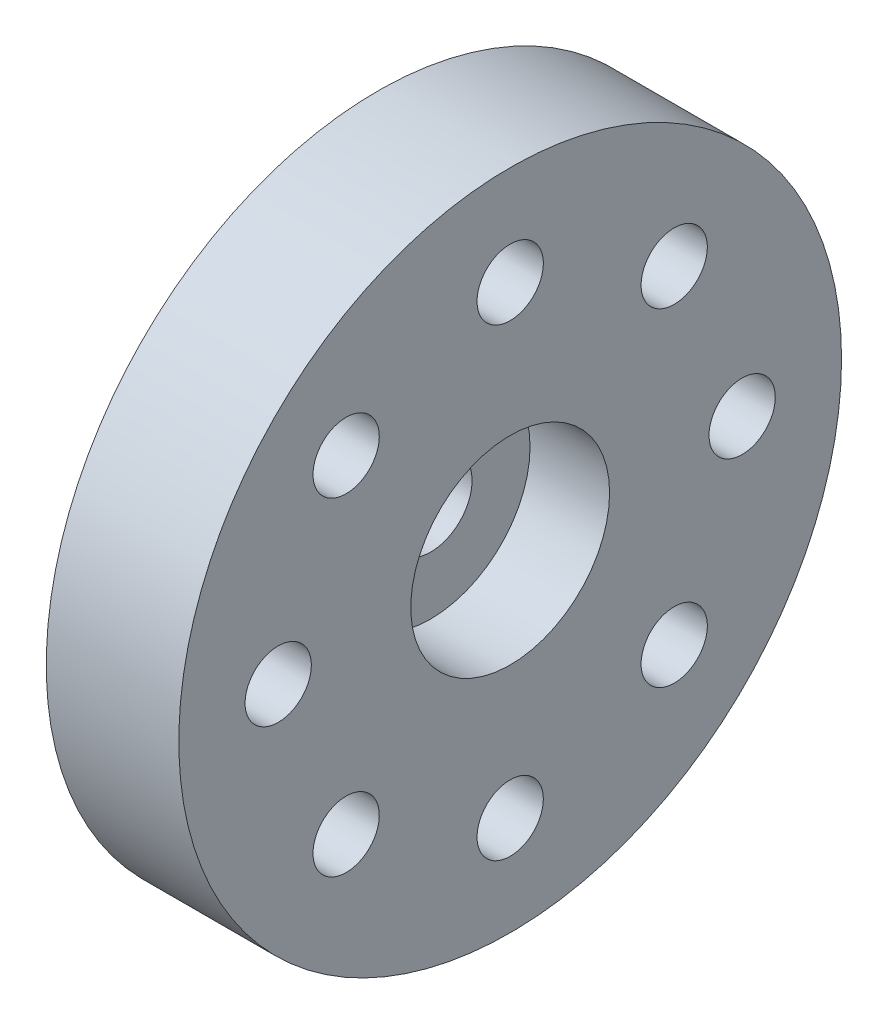
ISO-10303-21;
HEADER;
FILE_DESCRIPTION(('STEP AP214'),'2;1');
FILE_NAME('part.step','',(''),(''),'','','');
FILE_SCHEMA(('AUTOMOTIVE_DESIGN { 1 0 10303 214 1 1 1 1 }'));
ENDSEC;
DATA;
#1=APPLICATION_CONTEXT('core data for automotive mechanical design processes');
#2=APPLICATION_PROTOCOL_DEFINITION('international standard','automotive_design',2000,#1);
#3=PRODUCT_CONTEXT('',#1,'mechanical');
#4=PRODUCT('Part','Part','',(#3));
#5=PRODUCT_RELATED_PRODUCT_CATEGORY('part','',(#4));
#6=PRODUCT_DEFINITION_FORMATION('','',#4);
#7=PRODUCT_DEFINITION_CONTEXT('part definition',#1,'design');
#8=PRODUCT_DEFINITION('design','',#6,#7);
#9=PRODUCT_DEFINITION_SHAPE('','',#8);
#10=(LENGTH_UNIT() NAMED_UNIT(*) SI_UNIT(.MILLI.,.METRE.));
#11=(NAMED_UNIT(*) PLANE_ANGLE_UNIT() SI_UNIT($,.RADIAN.));
#12=(NAMED_UNIT(*) SI_UNIT($,.STERADIAN.) SOLID_ANGLE_UNIT());
#13=UNCERTAINTY_MEASURE_WITH_UNIT(LENGTH_MEASURE(1.E-05),#10,'distance_accuracy_value','');
#14=(GEOMETRIC_REPRESENTATION_CONTEXT(3) GLOBAL_UNCERTAINTY_ASSIGNED_CONTEXT((#13)) GLOBAL_UNIT_ASSIGNED_CONTEXT((#10,
#11,#12)) REPRESENTATION_CONTEXT('',''));
#15=CARTESIAN_POINT('',(0.,0.,0.));
#16=DIRECTION('',(0.,0.,1.));
#17=DIRECTION('',(1.,0.,0.));
#18=AXIS2_PLACEMENT_3D('',#15,#16,#17);
#19=CARTESIAN_POINT('',(0.,0.,0.));
#20=DIRECTION('',(1.,0.,0.));
#21=DIRECTION('',(0.,0.,-1.));
#22=AXIS2_PLACEMENT_3D('',#19,#20,#21);
#23=CYLINDRICAL_SURFACE('',#22,3.);
#24=CARTESIAN_POINT('',(4.,0.,0.));
#25=DIRECTION('',(1.,0.,0.));
#26=DIRECTION('',(0.,0.,-1.));
#27=AXIS2_PLACEMENT_3D('',#24,#25,#26);
#28=CIRCLE('',#27,3.);
#29=CARTESIAN_POINT('',(4.,0.,-3.));
#30=VERTEX_POINT('',#29);
#31=EDGE_CURVE('E62',#30,#30,#28,.T.);
#32=ORIENTED_EDGE('',*,*,#31,.T.);
#33=EDGE_LOOP('',(#32));
#34=FACE_BOUND('',#33,.T.);
#35=CARTESIAN_POINT('',(1.6,0.,0.));
#36=DIRECTION('',(-1.,0.,0.));
#37=DIRECTION('',(0.,0.,1.));
#38=AXIS2_PLACEMENT_3D('',#35,#36,#37);
#39=CIRCLE('',#38,3.);
#40=CARTESIAN_POINT('',(1.6,0.,3.));
#41=VERTEX_POINT('',#40);
#42=EDGE_CURVE('E10',#41,#41,#39,.F.);
#43=ORIENTED_EDGE('',*,*,#42,.F.);
#44=EDGE_LOOP('',(#43));
#45=FACE_BOUND('',#44,.T.);
#46=ADVANCED_FACE('F32',(#34,#45),#23,.F.);
#47=CARTESIAN_POINT('',(0.,0.,0.));
#48=DIRECTION('',(1.,0.,0.));
#49=DIRECTION('',(0.,0.,-1.));
#50=AXIS2_PLACEMENT_3D('',#47,#48,#49);
#51=PLANE('',#50);
#52=CARTESIAN_POINT('',(0.,0.,0.));
#53=DIRECTION('',(1.,0.,0.));
#54=DIRECTION('',(0.,0.,-1.));
#55=AXIS2_PLACEMENT_3D('',#52,#53,#54);
#56=CIRCLE('',#55,10.);
#57=CARTESIAN_POINT('',(0.,0.,-10.));
#58=VERTEX_POINT('',#57);
#59=EDGE_CURVE('E59',#58,#58,#56,.T.);
#60=ORIENTED_EDGE('',*,*,#59,.F.);
#61=EDGE_LOOP('',(#60));
#62=FACE_BOUND('',#61,.T.);
#63=CARTESIAN_POINT('',(0.,7.,0.));
#64=DIRECTION('',(-1.,0.,0.));
#65=DIRECTION('',(0.,0.,1.));
#66=AXIS2_PLACEMENT_3D('',#63,#64,#65);
#67=CIRCLE('',#66,1.);
#68=CARTESIAN_POINT('',(0.,7.,1.));
#69=VERTEX_POINT('',#68);
#70=EDGE_CURVE('E68',#69,#69,#67,.T.);
#71=ORIENTED_EDGE('',*,*,#70,.F.);
#72=EDGE_LOOP('',(#71));
#73=FACE_BOUND('',#72,.T.);
#74=CARTESIAN_POINT('',(0.,4.94974746830582,4.94974746830584));
#75=DIRECTION('',(-1.,0.,0.));
#76=DIRECTION('',(0.,-0.707106781186549,0.707106781186546));
#77=AXIS2_PLACEMENT_3D('',#74,#75,#76);
#78=CIRCLE('',#77,1.);
#79=CARTESIAN_POINT('',(0.,4.24264068711928,5.65685424949239));
#80=VERTEX_POINT('',#79);
#81=EDGE_CURVE('E74',#80,#80,#78,.T.);
#82=ORIENTED_EDGE('',*,*,#81,.F.);
#83=EDGE_LOOP('',(#82));
#84=FACE_BOUND('',#83,.T.);
#85=CARTESIAN_POINT('',(0.,0.,7.));
#86=DIRECTION('',(-1.,0.,0.));
#87=DIRECTION('',(0.,-1.,0.));
#88=AXIS2_PLACEMENT_3D('',#85,#86,#87);
#89=CIRCLE('',#88,1.);
#90=CARTESIAN_POINT('',(0.,-1.00000000000002,7.));
#91=VERTEX_POINT('',#90);
#92=EDGE_CURVE('E80',#91,#91,#89,.T.);
#93=ORIENTED_EDGE('',*,*,#92,.F.);
#94=EDGE_LOOP('',(#93));
#95=FACE_BOUND('',#94,.T.);
#96=CARTESIAN_POINT('',(0.,-4.94974746830586,4.94974746830581));
#97=DIRECTION('',(-1.,0.,0.));
#98=DIRECTION('',(0.,-0.707106781186544,-0.707106781186551));
#99=AXIS2_PLACEMENT_3D('',#96,#97,#98);
#100=CIRCLE('',#99,1.);
#101=CARTESIAN_POINT('',(0.,-5.6568542494924,4.24264068711926));
#102=VERTEX_POINT('',#101);
#103=EDGE_CURVE('E86',#102,#102,#100,.T.);
#104=ORIENTED_EDGE('',*,*,#103,.F.);
#105=EDGE_LOOP('',(#104));
#106=FACE_BOUND('',#105,.T.);
#107=CARTESIAN_POINT('',(0.,-7.,0.));
#108=DIRECTION('',(-1.,0.,0.));
#109=DIRECTION('',(0.,0.,-1.));
#110=AXIS2_PLACEMENT_3D('',#107,#108,#109);
#111=CIRCLE('',#110,1.);
#112=CARTESIAN_POINT('',(0.,-7.,-1.));
#113=VERTEX_POINT('',#112);
#114=EDGE_CURVE('E92',#113,#113,#111,.T.);
#115=ORIENTED_EDGE('',*,*,#114,.F.);
#116=EDGE_LOOP('',(#115));
#117=FACE_BOUND('',#116,.T.);
#118=CARTESIAN_POINT('',(0.,-4.94974746830579,-4.94974746830588));
#119=DIRECTION('',(-1.,0.,0.));
#120=DIRECTION('',(0.,0.707106781186554,-0.707106781186541));
#121=AXIS2_PLACEMENT_3D('',#118,#119,#120);
#122=CIRCLE('',#121,1.);
#123=CARTESIAN_POINT('',(0.,-4.24264068711924,-5.65685424949242));
#124=VERTEX_POINT('',#123);
#125=EDGE_CURVE('E98',#124,#124,#122,.T.);
#126=ORIENTED_EDGE('',*,*,#125,.F.);
#127=EDGE_LOOP('',(#126));
#128=FACE_BOUND('',#127,.T.);
#129=CARTESIAN_POINT('',(0.,0.,-7.));
#130=DIRECTION('',(-1.,0.,0.));
#131=DIRECTION('',(0.,1.,0.));
#132=AXIS2_PLACEMENT_3D('',#129,#130,#131);
#133=CIRCLE('',#132,1.);
#134=CARTESIAN_POINT('',(0.,1.00000000000007,-6.99999999999999));
#135=VERTEX_POINT('',#134);
#136=EDGE_CURVE('E104',#135,#135,#133,.T.);
#137=ORIENTED_EDGE('',*,*,#136,.F.);
#138=EDGE_LOOP('',(#137));
#139=FACE_BOUND('',#138,.T.);
#140=CARTESIAN_POINT('',(0.,4.94974746830589,-4.94974746830577));
#141=DIRECTION('',(-1.,0.,0.));
#142=DIRECTION('',(0.,0.707106781186539,0.707106781186556));
#143=AXIS2_PLACEMENT_3D('',#140,#141,#142);
#144=CIRCLE('',#143,1.);
#145=CARTESIAN_POINT('',(0.,5.65685424949243,-4.24264068711922));
#146=VERTEX_POINT('',#145);
#147=EDGE_CURVE('E110',#146,#146,#144,.T.);
#148=ORIENTED_EDGE('',*,*,#147,.F.);
#149=EDGE_LOOP('',(#148));
#150=FACE_BOUND('',#149,.T.);
#151=CARTESIAN_POINT('',(0.,0.,0.));
#152=DIRECTION('',(1.,0.,0.));
#153=DIRECTION('',(0.,0.,-1.));
#154=AXIS2_PLACEMENT_3D('',#151,#152,#153);
#155=CIRCLE('',#154,3.5);
#156=CARTESIAN_POINT('',(0.,0.,-3.5));
#157=VERTEX_POINT('',#156);
#158=EDGE_CURVE('E55',#157,#157,#155,.F.);
#159=ORIENTED_EDGE('',*,*,#158,.F.);
#160=EDGE_LOOP('',(#159));
#161=FACE_BOUND('',#160,.T.);
#162=ADVANCED_FACE('F161',(#62,#73,#84,#95,#106,#117,#128,#139,#150,#161),#51,.F.);
#163=CARTESIAN_POINT('',(4.,0.,0.));
#164=DIRECTION('',(-1.,0.,0.));
#165=DIRECTION('',(0.,0.,1.));
#166=AXIS2_PLACEMENT_3D('',#163,#164,#165);
#167=CYLINDRICAL_SURFACE('',#166,10.);
#168=CARTESIAN_POINT('',(4.,0.,0.));
#169=DIRECTION('',(1.,0.,0.));
#170=DIRECTION('',(0.,0.,-1.));
#171=AXIS2_PLACEMENT_3D('',#168,#169,#170);
#172=CIRCLE('',#171,10.);
#173=CARTESIAN_POINT('',(4.,0.,-10.));
#174=VERTEX_POINT('',#173);
#175=EDGE_CURVE('E58',#174,#174,#172,.T.);
#176=ORIENTED_EDGE('',*,*,#175,.F.);
#177=EDGE_LOOP('',(#176));
#178=FACE_BOUND('',#177,.T.);
#179=ORIENTED_EDGE('',*,*,#59,.T.);
#180=EDGE_LOOP('',(#179));
#181=FACE_BOUND('',#180,.T.);
#182=ADVANCED_FACE('F166',(#178,#181),#167,.T.);
#183=CARTESIAN_POINT('',(4.,0.,0.));
#184=DIRECTION('',(1.,0.,0.));
#185=DIRECTION('',(0.,0.,-1.));
#186=AXIS2_PLACEMENT_3D('',#183,#184,#185);
#187=PLANE('',#186);
#188=CARTESIAN_POINT('',(4.,4.94974746830589,-4.94974746830577));
#189=DIRECTION('',(-1.,0.,0.));
#190=DIRECTION('',(0.,0.707106781186539,0.707106781186556));
#191=AXIS2_PLACEMENT_3D('',#188,#189,#190);
#192=CIRCLE('',#191,1.);
#193=CARTESIAN_POINT('',(4.,5.65685424949243,-4.24264068711922));
#194=VERTEX_POINT('',#193);
#195=EDGE_CURVE('E107',#194,#194,#192,.T.);
#196=ORIENTED_EDGE('',*,*,#195,.T.);
#197=EDGE_LOOP('',(#196));
#198=FACE_BOUND('',#197,.T.);
#199=CARTESIAN_POINT('',(4.,0.,-7.));
#200=DIRECTION('',(-1.,0.,0.));
#201=DIRECTION('',(0.,1.,0.));
#202=AXIS2_PLACEMENT_3D('',#199,#200,#201);
#203=CIRCLE('',#202,1.);
#204=CARTESIAN_POINT('',(4.,1.00000000000007,-6.99999999999999));
#205=VERTEX_POINT('',#204);
#206=EDGE_CURVE('E101',#205,#205,#203,.T.);
#207=ORIENTED_EDGE('',*,*,#206,.T.);
#208=EDGE_LOOP('',(#207));
#209=FACE_BOUND('',#208,.T.);
#210=CARTESIAN_POINT('',(4.,-4.94974746830579,-4.94974746830588));
#211=DIRECTION('',(-1.,0.,0.));
#212=DIRECTION('',(0.,0.707106781186554,-0.707106781186541));
#213=AXIS2_PLACEMENT_3D('',#210,#211,#212);
#214=CIRCLE('',#213,1.);
#215=CARTESIAN_POINT('',(4.,-4.24264068711924,-5.65685424949242));
#216=VERTEX_POINT('',#215);
#217=EDGE_CURVE('E95',#216,#216,#214,.T.);
#218=ORIENTED_EDGE('',*,*,#217,.T.);
#219=EDGE_LOOP('',(#218));
#220=FACE_BOUND('',#219,.T.);
#221=CARTESIAN_POINT('',(4.,-7.,0.));
#222=DIRECTION('',(-1.,0.,0.));
#223=DIRECTION('',(0.,0.,-1.));
#224=AXIS2_PLACEMENT_3D('',#221,#222,#223);
#225=CIRCLE('',#224,1.);
#226=CARTESIAN_POINT('',(4.,-7.,-1.));
#227=VERTEX_POINT('',#226);
#228=EDGE_CURVE('E89',#227,#227,#225,.T.);
#229=ORIENTED_EDGE('',*,*,#228,.T.);
#230=EDGE_LOOP('',(#229));
#231=FACE_BOUND('',#230,.T.);
#232=CARTESIAN_POINT('',(4.,-4.94974746830586,4.94974746830581));
#233=DIRECTION('',(-1.,0.,0.));
#234=DIRECTION('',(0.,-0.707106781186544,-0.707106781186551));
#235=AXIS2_PLACEMENT_3D('',#232,#233,#234);
#236=CIRCLE('',#235,1.);
#237=CARTESIAN_POINT('',(4.,-5.6568542494924,4.24264068711926));
#238=VERTEX_POINT('',#237);
#239=EDGE_CURVE('E83',#238,#238,#236,.T.);
#240=ORIENTED_EDGE('',*,*,#239,.T.);
#241=EDGE_LOOP('',(#240));
#242=FACE_BOUND('',#241,.T.);
#243=CARTESIAN_POINT('',(4.,0.,7.));
#244=DIRECTION('',(-1.,0.,0.));
#245=DIRECTION('',(0.,-1.,0.));
#246=AXIS2_PLACEMENT_3D('',#243,#244,#245);
#247=CIRCLE('',#246,1.);
#248=CARTESIAN_POINT('',(4.,-1.00000000000002,7.));
#249=VERTEX_POINT('',#248);
#250=EDGE_CURVE('E77',#249,#249,#247,.T.);
#251=ORIENTED_EDGE('',*,*,#250,.T.);
#252=EDGE_LOOP('',(#251));
#253=FACE_BOUND('',#252,.T.);
#254=CARTESIAN_POINT('',(4.,4.94974746830582,4.94974746830584));
#255=DIRECTION('',(-1.,0.,0.));
#256=DIRECTION('',(0.,-0.707106781186549,0.707106781186546));
#257=AXIS2_PLACEMENT_3D('',#254,#255,#256);
#258=CIRCLE('',#257,1.);
#259=CARTESIAN_POINT('',(4.,4.24264068711928,5.65685424949239));
#260=VERTEX_POINT('',#259);
#261=EDGE_CURVE('E71',#260,#260,#258,.T.);
#262=ORIENTED_EDGE('',*,*,#261,.T.);
#263=EDGE_LOOP('',(#262));
#264=FACE_BOUND('',#263,.T.);
#265=CARTESIAN_POINT('',(4.,7.,0.));
#266=DIRECTION('',(-1.,0.,0.));
#267=DIRECTION('',(0.,0.,1.));
#268=AXIS2_PLACEMENT_3D('',#265,#266,#267);
#269=CIRCLE('',#268,1.);
#270=CARTESIAN_POINT('',(4.,7.,1.));
#271=VERTEX_POINT('',#270);
#272=EDGE_CURVE('E67',#271,#271,#269,.T.);
#273=ORIENTED_EDGE('',*,*,#272,.T.);
#274=EDGE_LOOP('',(#273));
#275=FACE_BOUND('',#274,.T.);
#276=ORIENTED_EDGE('',*,*,#31,.F.);
#277=EDGE_LOOP('',(#276));
#278=FACE_BOUND('',#277,.T.);
#279=ORIENTED_EDGE('',*,*,#175,.T.);
#280=EDGE_LOOP('',(#279));
#281=FACE_BOUND('',#280,.T.);
#282=ADVANCED_FACE('F143',(#198,#209,#220,#231,#242,#253,#264,#275,#278,#281),#187,.T.);
#283=CARTESIAN_POINT('',(0.,0.,0.));
#284=DIRECTION('',(-1.,0.,0.));
#285=DIRECTION('',(0.,0.,1.));
#286=AXIS2_PLACEMENT_3D('',#283,#284,#285);
#287=CIRCLE('',#286,3.);
#288=CARTESIAN_POINT('',(0.,0.,3.));
#289=VERTEX_POINT('',#288);
#290=EDGE_CURVE('E113',#289,#289,#287,.F.);
#291=ORIENTED_EDGE('',*,*,#290,.T.);
#292=EDGE_LOOP('',(#291));
#293=FACE_BOUND('',#292,.T.);
#294=CARTESIAN_POINT('',(-0.3,0.,0.));
#295=DIRECTION('',(-1.,0.,0.));
#296=DIRECTION('',(0.,0.,1.));
#297=AXIS2_PLACEMENT_3D('',#294,#295,#296);
#298=CIRCLE('',#297,3.);
#299=CARTESIAN_POINT('',(-0.3,0.,3.));
#300=VERTEX_POINT('',#299);
#301=EDGE_CURVE('E52',#300,#300,#298,.T.);
#302=ORIENTED_EDGE('',*,*,#301,.T.);
#303=EDGE_LOOP('',(#302));
#304=FACE_BOUND('',#303,.T.);
#305=ADVANCED_FACE('F139',(#293,#304),#23,.F.);
#306=CARTESIAN_POINT('',(4.,7.,0.));
#307=DIRECTION('',(-1.,0.,0.));
#308=DIRECTION('',(0.,0.,1.));
#309=AXIS2_PLACEMENT_3D('',#306,#307,#308);
#310=CYLINDRICAL_SURFACE('',#309,1.);
#311=ORIENTED_EDGE('',*,*,#272,.F.);
#312=EDGE_LOOP('',(#311));
#313=FACE_BOUND('',#312,.T.);
#314=ORIENTED_EDGE('',*,*,#70,.T.);
#315=EDGE_LOOP('',(#314));
#316=FACE_BOUND('',#315,.T.);
#317=ADVANCED_FACE('F142',(#313,#316),#310,.F.);
#318=CARTESIAN_POINT('',(4.,4.94974746830582,4.94974746830584));
#319=DIRECTION('',(-1.,0.,0.));
#320=DIRECTION('',(0.,0.,1.));
#321=AXIS2_PLACEMENT_3D('',#318,#319,#320);
#322=CYLINDRICAL_SURFACE('',#321,1.);
#323=ORIENTED_EDGE('',*,*,#261,.F.);
#324=EDGE_LOOP('',(#323));
#325=FACE_BOUND('',#324,.T.);
#326=ORIENTED_EDGE('',*,*,#81,.T.);
#327=EDGE_LOOP('',(#326));
#328=FACE_BOUND('',#327,.T.);
#329=ADVANCED_FACE('F231',(#325,#328),#322,.F.);
#330=CARTESIAN_POINT('',(4.,0.,7.));
#331=DIRECTION('',(-1.,0.,0.));
#332=DIRECTION('',(0.,0.,1.));
#333=AXIS2_PLACEMENT_3D('',#330,#331,#332);
#334=CYLINDRICAL_SURFACE('',#333,1.);
#335=ORIENTED_EDGE('',*,*,#250,.F.);
#336=EDGE_LOOP('',(#335));
#337=FACE_BOUND('',#336,.T.);
#338=ORIENTED_EDGE('',*,*,#92,.T.);
#339=EDGE_LOOP('',(#338));
#340=FACE_BOUND('',#339,.T.);
#341=ADVANCED_FACE('F228',(#337,#340),#334,.F.);
#342=CARTESIAN_POINT('',(4.,-4.94974746830586,4.94974746830581));
#343=DIRECTION('',(-1.,0.,0.));
#344=DIRECTION('',(0.,0.,1.));
#345=AXIS2_PLACEMENT_3D('',#342,#343,#344);
#346=CYLINDRICAL_SURFACE('',#345,1.);
#347=ORIENTED_EDGE('',*,*,#239,.F.);
#348=EDGE_LOOP('',(#347));
#349=FACE_BOUND('',#348,.T.);
#350=ORIENTED_EDGE('',*,*,#103,.T.);
#351=EDGE_LOOP('',(#350));
#352=FACE_BOUND('',#351,.T.);
#353=ADVANCED_FACE('F224',(#349,#352),#346,.F.);
#354=CARTESIAN_POINT('',(4.,-7.,0.));
#355=DIRECTION('',(-1.,0.,0.));
#356=DIRECTION('',(0.,0.,1.));
#357=AXIS2_PLACEMENT_3D('',#354,#355,#356);
#358=CYLINDRICAL_SURFACE('',#357,1.);
#359=ORIENTED_EDGE('',*,*,#228,.F.);
#360=EDGE_LOOP('',(#359));
#361=FACE_BOUND('',#360,.T.);
#362=ORIENTED_EDGE('',*,*,#114,.T.);
#363=EDGE_LOOP('',(#362));
#364=FACE_BOUND('',#363,.T.);
#365=ADVANCED_FACE('F220',(#361,#364),#358,.F.);
#366=CARTESIAN_POINT('',(4.,-4.94974746830579,-4.94974746830588));
#367=DIRECTION('',(-1.,0.,0.));
#368=DIRECTION('',(0.,0.,1.));
#369=AXIS2_PLACEMENT_3D('',#366,#367,#368);
#370=CYLINDRICAL_SURFACE('',#369,1.);
#371=ORIENTED_EDGE('',*,*,#217,.F.);
#372=EDGE_LOOP('',(#371));
#373=FACE_BOUND('',#372,.T.);
#374=ORIENTED_EDGE('',*,*,#125,.T.);
#375=EDGE_LOOP('',(#374));
#376=FACE_BOUND('',#375,.T.);
#377=ADVANCED_FACE('F213',(#373,#376),#370,.F.);
#378=CARTESIAN_POINT('',(4.,0.,-7.));
#379=DIRECTION('',(-1.,0.,0.));
#380=DIRECTION('',(0.,0.,1.));
#381=AXIS2_PLACEMENT_3D('',#378,#379,#380);
#382=CYLINDRICAL_SURFACE('',#381,1.);
#383=ORIENTED_EDGE('',*,*,#206,.F.);
#384=EDGE_LOOP('',(#383));
#385=FACE_BOUND('',#384,.T.);
#386=ORIENTED_EDGE('',*,*,#136,.T.);
#387=EDGE_LOOP('',(#386));
#388=FACE_BOUND('',#387,.T.);
#389=ADVANCED_FACE('F204',(#385,#388),#382,.F.);
#390=CARTESIAN_POINT('',(4.,4.94974746830589,-4.94974746830577));
#391=DIRECTION('',(-1.,0.,0.));
#392=DIRECTION('',(0.,0.,1.));
#393=AXIS2_PLACEMENT_3D('',#390,#391,#392);
#394=CYLINDRICAL_SURFACE('',#393,1.);
#395=ORIENTED_EDGE('',*,*,#195,.F.);
#396=EDGE_LOOP('',(#395));
#397=FACE_BOUND('',#396,.T.);
#398=ORIENTED_EDGE('',*,*,#147,.T.);
#399=EDGE_LOOP('',(#398));
#400=FACE_BOUND('',#399,.T.);
#401=ADVANCED_FACE('F202',(#397,#400),#394,.F.);
#402=CARTESIAN_POINT('',(-0.5,0.,0.));
#403=DIRECTION('',(-1.,0.,0.));
#404=DIRECTION('',(0.,0.,1.));
#405=AXIS2_PLACEMENT_3D('',#402,#403,#404);
#406=PLANE('',#405);
#407=CARTESIAN_POINT('',(-0.5,0.,0.));
#408=DIRECTION('',(-1.,0.,0.));
#409=DIRECTION('',(0.,0.,1.));
#410=AXIS2_PLACEMENT_3D('',#407,#408,#409);
#411=CIRCLE('',#410,3.2);
#412=CARTESIAN_POINT('',(-0.5,0.,3.2));
#413=VERTEX_POINT('',#412);
#414=EDGE_CURVE('E43',#413,#413,#411,.F.);
#415=ORIENTED_EDGE('',*,*,#414,.T.);
#416=EDGE_LOOP('',(#415));
#417=FACE_BOUND('',#416,.T.);
#418=CARTESIAN_POINT('',(-0.5,0.,0.));
#419=DIRECTION('',(-1.,0.,0.));
#420=DIRECTION('',(0.,0.,1.));
#421=AXIS2_PLACEMENT_3D('',#418,#419,#420);
#422=CIRCLE('',#421,3.3);
#423=CARTESIAN_POINT('',(-0.5,0.,3.3));
#424=VERTEX_POINT('',#423);
#425=EDGE_CURVE('E47',#424,#424,#422,.T.);
#426=ORIENTED_EDGE('',*,*,#425,.T.);
#427=EDGE_LOOP('',(#426));
#428=FACE_BOUND('',#427,.T.);
#429=ADVANCED_FACE('F156',(#417,#428),#406,.T.);
#430=CARTESIAN_POINT('',(-0.5,0.,0.));
#431=DIRECTION('',(1.,0.,0.));
#432=DIRECTION('',(0.,0.,-1.));
#433=AXIS2_PLACEMENT_3D('',#430,#431,#432);
#434=CYLINDRICAL_SURFACE('',#433,3.5);
#435=CARTESIAN_POINT('',(-0.3,0.,0.));
#436=DIRECTION('',(-1.,0.,0.));
#437=DIRECTION('',(0.,0.,1.));
#438=AXIS2_PLACEMENT_3D('',#435,#436,#437);
#439=CIRCLE('',#438,3.5);
#440=CARTESIAN_POINT('',(-0.3,0.,3.5));
#441=VERTEX_POINT('',#440);
#442=EDGE_CURVE('E39',#441,#441,#439,.F.);
#443=ORIENTED_EDGE('',*,*,#442,.T.);
#444=EDGE_LOOP('',(#443));
#445=FACE_BOUND('',#444,.T.);
#446=ORIENTED_EDGE('',*,*,#158,.T.);
#447=EDGE_LOOP('',(#446));
#448=FACE_BOUND('',#447,.T.);
#449=ADVANCED_FACE('F149',(#445,#448),#434,.T.);
#450=CARTESIAN_POINT('',(-0.3,0.,0.));
#451=DIRECTION('',(-1.,0.,0.));
#452=DIRECTION('',(0.,0.,1.));
#453=AXIS2_PLACEMENT_3D('',#450,#451,#452);
#454=TOROIDAL_SURFACE('',#453,3.2,0.2);
#455=ORIENTED_EDGE('',*,*,#414,.F.);
#456=EDGE_LOOP('',(#455));
#457=FACE_BOUND('',#456,.T.);
#458=ORIENTED_EDGE('',*,*,#301,.F.);
#459=EDGE_LOOP('',(#458));
#460=FACE_BOUND('',#459,.T.);
#461=ADVANCED_FACE('F147',(#457,#460),#454,.T.);
#462=CARTESIAN_POINT('',(-0.3,0.,0.));
#463=DIRECTION('',(-1.,0.,0.));
#464=DIRECTION('',(0.,0.,1.));
#465=AXIS2_PLACEMENT_3D('',#462,#463,#464);
#466=TOROIDAL_SURFACE('',#465,3.3,0.2);
#467=ORIENTED_EDGE('',*,*,#442,.F.);
#468=EDGE_LOOP('',(#467));
#469=FACE_BOUND('',#468,.T.);
#470=ORIENTED_EDGE('',*,*,#425,.F.);
#471=EDGE_LOOP('',(#470));
#472=FACE_BOUND('',#471,.T.);
#473=ADVANCED_FACE('F34',(#469,#472),#466,.T.);
#474=CARTESIAN_POINT('',(1.6,0.,0.));
#475=DIRECTION('',(-1.,0.,0.));
#476=DIRECTION('',(0.,0.,1.));
#477=AXIS2_PLACEMENT_3D('',#474,#475,#476);
#478=PLANE('',#477);
#479=CARTESIAN_POINT('',(1.6,0.,0.));
#480=DIRECTION('',(-1.,0.,0.));
#481=DIRECTION('',(0.,0.,1.));
#482=AXIS2_PLACEMENT_3D('',#479,#480,#481);
#483=CIRCLE('',#482,1.25);
#484=CARTESIAN_POINT('',(1.6,0.,1.25));
#485=VERTEX_POINT('',#484);
#486=EDGE_CURVE('E118',#485,#485,#483,.T.);
#487=ORIENTED_EDGE('',*,*,#486,.T.);
#488=EDGE_LOOP('',(#487));
#489=FACE_BOUND('',#488,.T.);
#490=ORIENTED_EDGE('',*,*,#42,.T.);
#491=EDGE_LOOP('',(#490));
#492=FACE_BOUND('',#491,.T.);
#493=ADVANCED_FACE('F125',(#489,#492),#478,.F.);
#494=CARTESIAN_POINT('',(0.,0.,0.));
#495=DIRECTION('',(-1.,0.,0.));
#496=DIRECTION('',(0.,0.,1.));
#497=AXIS2_PLACEMENT_3D('',#494,#495,#496);
#498=PLANE('',#497);
#499=CARTESIAN_POINT('',(0.,0.,0.));
#500=DIRECTION('',(-1.,0.,0.));
#501=DIRECTION('',(0.,0.,1.));
#502=AXIS2_PLACEMENT_3D('',#499,#500,#501);
#503=CIRCLE('',#502,1.25);
#504=CARTESIAN_POINT('',(0.,0.,1.25));
#505=VERTEX_POINT('',#504);
#506=EDGE_CURVE('E119',#505,#505,#503,.T.);
#507=ORIENTED_EDGE('',*,*,#506,.F.);
#508=EDGE_LOOP('',(#507));
#509=FACE_BOUND('',#508,.T.);
#510=ORIENTED_EDGE('',*,*,#290,.F.);
#511=EDGE_LOOP('',(#510));
#512=FACE_BOUND('',#511,.T.);
#513=ADVANCED_FACE('F130',(#509,#512),#498,.T.);
#514=CARTESIAN_POINT('',(1.6,0.,0.));
#515=DIRECTION('',(-1.,0.,0.));
#516=DIRECTION('',(0.,0.,1.));
#517=AXIS2_PLACEMENT_3D('',#514,#515,#516);
#518=CYLINDRICAL_SURFACE('',#517,1.25);
#519=ORIENTED_EDGE('',*,*,#486,.F.);
#520=EDGE_LOOP('',(#519));
#521=FACE_BOUND('',#520,.T.);
#522=ORIENTED_EDGE('',*,*,#506,.T.);
#523=EDGE_LOOP('',(#522));
#524=FACE_BOUND('',#523,.T.);
#525=ADVANCED_FACE('F127',(#521,#524),#518,.F.);
#526=CLOSED_SHELL('',(#46,#162,#182,#282,#305,#317,#329,#341,#353,#365,#377,#389,#401,#429,#449,
#461,#473,#493,#513,#525));
#527=MANIFOLD_SOLID_BREP('B2',#526);
#528=ADVANCED_BREP_SHAPE_REPRESENTATION('',(#18,#527),#14);
#529=SHAPE_DEFINITION_REPRESENTATION(#9,#528);
ENDSEC;
END-ISO-10303-21;
